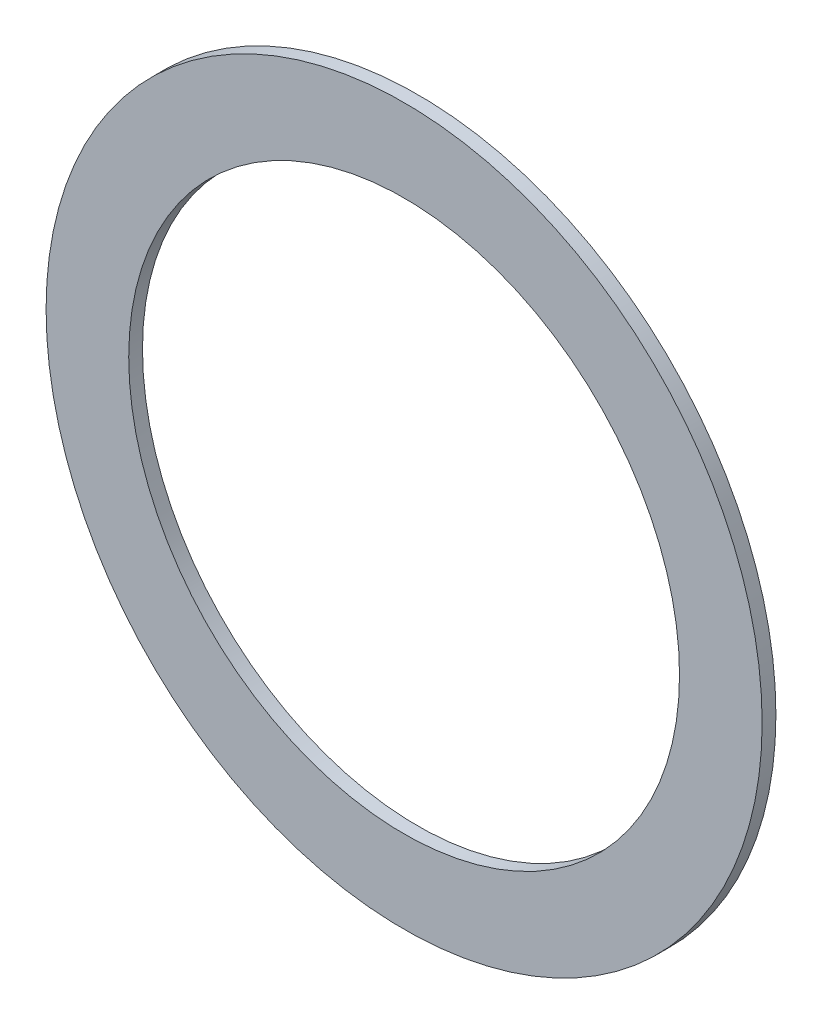
ISO-10303-21;
HEADER;
FILE_DESCRIPTION(('STEP AP214'),'2;1');
FILE_NAME('part.step','',(''),(''),'','','');
FILE_SCHEMA(('AUTOMOTIVE_DESIGN { 1 0 10303 214 1 1 1 1 }'));
ENDSEC;
DATA;
#1=APPLICATION_CONTEXT('core data for automotive mechanical design processes');
#2=APPLICATION_PROTOCOL_DEFINITION('international standard','automotive_design',2000,#1);
#3=PRODUCT_CONTEXT('',#1,'mechanical');
#4=PRODUCT('Part','Part','',(#3));
#5=PRODUCT_RELATED_PRODUCT_CATEGORY('part','',(#4));
#6=PRODUCT_DEFINITION_FORMATION('','',#4);
#7=PRODUCT_DEFINITION_CONTEXT('part definition',#1,'design');
#8=PRODUCT_DEFINITION('design','',#6,#7);
#9=PRODUCT_DEFINITION_SHAPE('','',#8);
#10=(LENGTH_UNIT() NAMED_UNIT(*) SI_UNIT(.MILLI.,.METRE.));
#11=(NAMED_UNIT(*) PLANE_ANGLE_UNIT() SI_UNIT($,.RADIAN.));
#12=(NAMED_UNIT(*) SI_UNIT($,.STERADIAN.) SOLID_ANGLE_UNIT());
#13=UNCERTAINTY_MEASURE_WITH_UNIT(LENGTH_MEASURE(1.E-05),#10,'distance_accuracy_value','');
#14=(GEOMETRIC_REPRESENTATION_CONTEXT(3) GLOBAL_UNCERTAINTY_ASSIGNED_CONTEXT((#13)) GLOBAL_UNIT_ASSIGNED_CONTEXT((#10,
#11,#12)) REPRESENTATION_CONTEXT('',''));
#15=CARTESIAN_POINT('',(0.,0.,0.));
#16=DIRECTION('',(0.,0.,1.));
#17=DIRECTION('',(1.,0.,0.));
#18=AXIS2_PLACEMENT_3D('',#15,#16,#17);
#19=CARTESIAN_POINT('',(0.,0.,1.));
#20=DIRECTION('',(0.,0.,1.));
#21=DIRECTION('',(1.,0.,0.));
#22=AXIS2_PLACEMENT_3D('',#19,#20,#21);
#23=PLANE('',#22);
#24=CARTESIAN_POINT('',(0.,0.,1.));
#25=DIRECTION('',(0.,0.,1.));
#26=DIRECTION('',(1.,0.,0.));
#27=AXIS2_PLACEMENT_3D('',#24,#25,#26);
#28=CIRCLE('',#27,26.);
#29=CARTESIAN_POINT('',(26.,0.,1.));
#30=VERTEX_POINT('',#29);
#31=EDGE_CURVE('E10',#30,#30,#28,.T.);
#32=ORIENTED_EDGE('',*,*,#31,.T.);
#33=EDGE_LOOP('',(#32));
#34=FACE_BOUND('',#33,.T.);
#35=CARTESIAN_POINT('',(0.,0.,1.));
#36=DIRECTION('',(0.,0.,1.));
#37=DIRECTION('',(1.,0.,0.));
#38=AXIS2_PLACEMENT_3D('',#35,#36,#37);
#39=CIRCLE('',#38,20.);
#40=CARTESIAN_POINT('',(20.,0.,1.));
#41=VERTEX_POINT('',#40);
#42=EDGE_CURVE('E39',#41,#41,#39,.T.);
#43=ORIENTED_EDGE('',*,*,#42,.F.);
#44=EDGE_LOOP('',(#43));
#45=FACE_BOUND('',#44,.T.);
#46=ADVANCED_FACE('F28',(#34,#45),#23,.T.);
#47=CARTESIAN_POINT('',(0.,0.,0.));
#48=DIRECTION('',(0.,0.,1.));
#49=DIRECTION('',(1.,0.,0.));
#50=AXIS2_PLACEMENT_3D('',#47,#48,#49);
#51=PLANE('',#50);
#52=CARTESIAN_POINT('',(0.,0.,0.));
#53=DIRECTION('',(0.,0.,1.));
#54=DIRECTION('',(1.,0.,0.));
#55=AXIS2_PLACEMENT_3D('',#52,#53,#54);
#56=CIRCLE('',#55,26.);
#57=CARTESIAN_POINT('',(26.,0.,0.));
#58=VERTEX_POINT('',#57);
#59=EDGE_CURVE('E35',#58,#58,#56,.T.);
#60=ORIENTED_EDGE('',*,*,#59,.F.);
#61=EDGE_LOOP('',(#60));
#62=FACE_BOUND('',#61,.T.);
#63=CARTESIAN_POINT('',(0.,0.,0.));
#64=DIRECTION('',(0.,0.,1.));
#65=DIRECTION('',(1.,0.,0.));
#66=AXIS2_PLACEMENT_3D('',#63,#64,#65);
#67=CIRCLE('',#66,20.);
#68=CARTESIAN_POINT('',(20.,0.,0.));
#69=VERTEX_POINT('',#68);
#70=EDGE_CURVE('E43',#69,#69,#67,.T.);
#71=ORIENTED_EDGE('',*,*,#70,.T.);
#72=EDGE_LOOP('',(#71));
#73=FACE_BOUND('',#72,.T.);
#74=ADVANCED_FACE('F49',(#62,#73),#51,.F.);
#75=CARTESIAN_POINT('',(0.,0.,1.));
#76=DIRECTION('',(0.,0.,-1.));
#77=DIRECTION('',(-1.,0.,0.));
#78=AXIS2_PLACEMENT_3D('',#75,#76,#77);
#79=CYLINDRICAL_SURFACE('',#78,26.);
#80=ORIENTED_EDGE('',*,*,#31,.F.);
#81=EDGE_LOOP('',(#80));
#82=FACE_BOUND('',#81,.T.);
#83=ORIENTED_EDGE('',*,*,#59,.T.);
#84=EDGE_LOOP('',(#83));
#85=FACE_BOUND('',#84,.T.);
#86=ADVANCED_FACE('F30',(#82,#85),#79,.T.);
#87=CARTESIAN_POINT('',(0.,0.,1.));
#88=DIRECTION('',(0.,0.,-1.));
#89=DIRECTION('',(-1.,0.,0.));
#90=AXIS2_PLACEMENT_3D('',#87,#88,#89);
#91=CYLINDRICAL_SURFACE('',#90,20.);
#92=ORIENTED_EDGE('',*,*,#42,.T.);
#93=EDGE_LOOP('',(#92));
#94=FACE_BOUND('',#93,.T.);
#95=ORIENTED_EDGE('',*,*,#70,.F.);
#96=EDGE_LOOP('',(#95));
#97=FACE_BOUND('',#96,.T.);
#98=ADVANCED_FACE('F51',(#94,#97),#91,.F.);
#99=CLOSED_SHELL('',(#46,#74,#86,#98));
#100=MANIFOLD_SOLID_BREP('B2',#99);
#101=ADVANCED_BREP_SHAPE_REPRESENTATION('',(#18,#100),#14);
#102=SHAPE_DEFINITION_REPRESENTATION(#9,#101);
ENDSEC;
END-ISO-10303-21;
